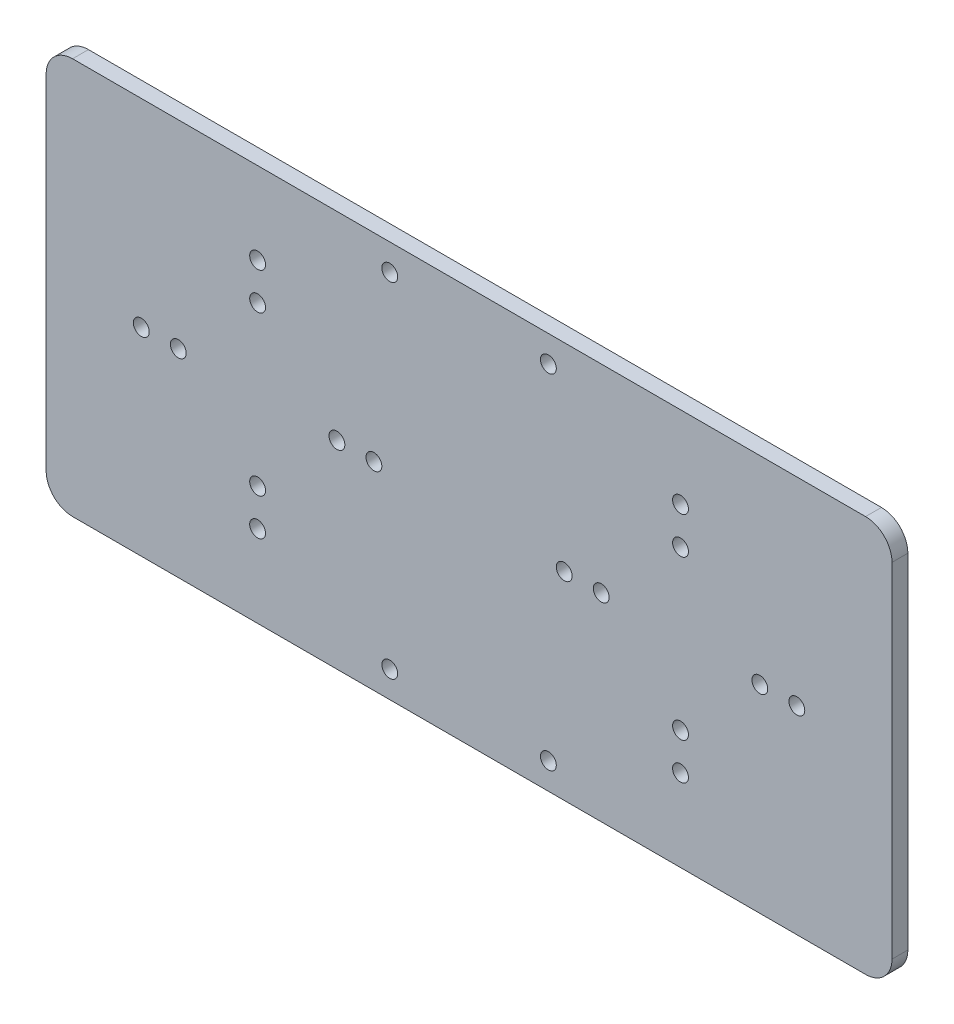
ISO-10303-21;
HEADER;
FILE_DESCRIPTION(('STEP AP214'),'2;1');
FILE_NAME('part.step','',(''),(''),'','','');
FILE_SCHEMA(('AUTOMOTIVE_DESIGN { 1 0 10303 214 1 1 1 1 }'));
ENDSEC;
DATA;
#1=APPLICATION_CONTEXT('core data for automotive mechanical design processes');
#2=APPLICATION_PROTOCOL_DEFINITION('international standard','automotive_design',2000,#1);
#3=PRODUCT_CONTEXT('',#1,'mechanical');
#4=PRODUCT('Part','Part','',(#3));
#5=PRODUCT_RELATED_PRODUCT_CATEGORY('part','',(#4));
#6=PRODUCT_DEFINITION_FORMATION('','',#4);
#7=PRODUCT_DEFINITION_CONTEXT('part definition',#1,'design');
#8=PRODUCT_DEFINITION('design','',#6,#7);
#9=PRODUCT_DEFINITION_SHAPE('','',#8);
#10=(LENGTH_UNIT() NAMED_UNIT(*) SI_UNIT(.MILLI.,.METRE.));
#11=(NAMED_UNIT(*) PLANE_ANGLE_UNIT() SI_UNIT($,.RADIAN.));
#12=(NAMED_UNIT(*) SI_UNIT($,.STERADIAN.) SOLID_ANGLE_UNIT());
#13=UNCERTAINTY_MEASURE_WITH_UNIT(LENGTH_MEASURE(1.E-05),#10,'distance_accuracy_value','');
#14=(GEOMETRIC_REPRESENTATION_CONTEXT(3) GLOBAL_UNCERTAINTY_ASSIGNED_CONTEXT((#13)) GLOBAL_UNIT_ASSIGNED_CONTEXT((#10,
#11,#12)) REPRESENTATION_CONTEXT('',''));
#15=CARTESIAN_POINT('',(0.,0.,0.));
#16=DIRECTION('',(0.,0.,1.));
#17=DIRECTION('',(1.,0.,0.));
#18=AXIS2_PLACEMENT_3D('',#15,#16,#17);
#19=CARTESIAN_POINT('',(0.,0.,3.));
#20=DIRECTION('',(1.,0.,0.));
#21=DIRECTION('',(0.,1.,0.));
#22=AXIS2_PLACEMENT_3D('',#19,#20,#21);
#23=PLANE('',#22);
#24=DIRECTION('',(0.,-1.,0.));
#25=VECTOR('',#24,1.);
#26=CARTESIAN_POINT('',(0.,0.,0.));
#27=LINE('',#26,#25);
#28=CARTESIAN_POINT('',(0.,-5.,0.));
#29=VERTEX_POINT('',#28);
#30=CARTESIAN_POINT('',(0.,-70.,0.));
#31=VERTEX_POINT('',#30);
#32=EDGE_CURVE('E189',#29,#31,#27,.T.);
#33=ORIENTED_EDGE('',*,*,#32,.T.);
#34=DIRECTION('',(0.,0.,-1.));
#35=VECTOR('',#34,1.);
#36=CARTESIAN_POINT('',(0.,-70.,3.));
#37=LINE('',#36,#35);
#38=CARTESIAN_POINT('',(0.,-70.,3.));
#39=VERTEX_POINT('',#38);
#40=EDGE_CURVE('E166',#31,#39,#37,.F.);
#41=ORIENTED_EDGE('',*,*,#40,.T.);
#42=DIRECTION('',(0.,-1.,0.));
#43=VECTOR('',#42,1.);
#44=CARTESIAN_POINT('',(0.,0.,3.));
#45=LINE('',#44,#43);
#46=CARTESIAN_POINT('',(0.,-5.,3.));
#47=VERTEX_POINT('',#46);
#48=EDGE_CURVE('E130',#47,#39,#45,.T.);
#49=ORIENTED_EDGE('',*,*,#48,.F.);
#50=DIRECTION('',(0.,0.,-1.));
#51=VECTOR('',#50,1.);
#52=CARTESIAN_POINT('',(0.,-5.,3.));
#53=LINE('',#52,#51);
#54=EDGE_CURVE('E147',#47,#29,#53,.T.);
#55=ORIENTED_EDGE('',*,*,#54,.T.);
#56=EDGE_LOOP('',(#33,#41,#49,#55));
#57=FACE_BOUND('',#56,.T.);
#58=ADVANCED_FACE('F39',(#57),#23,.F.);
#59=CARTESIAN_POINT('',(0.,-75.,3.));
#60=DIRECTION('',(0.,1.,0.));
#61=DIRECTION('',(0.,0.,1.));
#62=AXIS2_PLACEMENT_3D('',#59,#60,#61);
#63=PLANE('',#62);
#64=DIRECTION('',(1.,0.,0.));
#65=VECTOR('',#64,1.);
#66=CARTESIAN_POINT('',(0.,-75.,0.));
#67=LINE('',#66,#65);
#68=CARTESIAN_POINT('',(5.00000000000001,-75.,0.));
#69=VERTEX_POINT('',#68);
#70=CARTESIAN_POINT('',(155.,-75.,0.));
#71=VERTEX_POINT('',#70);
#72=EDGE_CURVE('E138',#69,#71,#67,.T.);
#73=ORIENTED_EDGE('',*,*,#72,.T.);
#74=DIRECTION('',(0.,0.,-1.));
#75=VECTOR('',#74,1.);
#76=CARTESIAN_POINT('',(155.,-75.,3.));
#77=LINE('',#76,#75);
#78=CARTESIAN_POINT('',(155.,-75.,3.));
#79=VERTEX_POINT('',#78);
#80=EDGE_CURVE('E48',#71,#79,#77,.F.);
#81=ORIENTED_EDGE('',*,*,#80,.T.);
#82=DIRECTION('',(1.,0.,0.));
#83=VECTOR('',#82,1.);
#84=CARTESIAN_POINT('',(0.,-75.,3.));
#85=LINE('',#84,#83);
#86=CARTESIAN_POINT('',(5.00000000000001,-75.,3.));
#87=VERTEX_POINT('',#86);
#88=EDGE_CURVE('E136',#87,#79,#85,.T.);
#89=ORIENTED_EDGE('',*,*,#88,.F.);
#90=DIRECTION('',(0.,0.,-1.));
#91=VECTOR('',#90,1.);
#92=CARTESIAN_POINT('',(5.00000000000001,-75.,3.));
#93=LINE('',#92,#91);
#94=EDGE_CURVE('E159',#87,#69,#93,.T.);
#95=ORIENTED_EDGE('',*,*,#94,.T.);
#96=EDGE_LOOP('',(#73,#81,#89,#95));
#97=FACE_BOUND('',#96,.T.);
#98=ADVANCED_FACE('F194',(#97),#63,.F.);
#99=CARTESIAN_POINT('',(160.,0.,3.));
#100=DIRECTION('',(-1.,0.,0.));
#101=DIRECTION('',(0.,0.,1.));
#102=AXIS2_PLACEMENT_3D('',#99,#100,#101);
#103=PLANE('',#102);
#104=DIRECTION('',(0.,1.,0.));
#105=VECTOR('',#104,1.);
#106=CARTESIAN_POINT('',(160.,0.,3.));
#107=LINE('',#106,#105);
#108=CARTESIAN_POINT('',(160.,-70.,3.));
#109=VERTEX_POINT('',#108);
#110=CARTESIAN_POINT('',(160.,-5.,3.));
#111=VERTEX_POINT('',#110);
#112=EDGE_CURVE('E180',#109,#111,#107,.T.);
#113=ORIENTED_EDGE('',*,*,#112,.F.);
#114=DIRECTION('',(0.,0.,-1.));
#115=VECTOR('',#114,1.);
#116=CARTESIAN_POINT('',(160.,-70.,3.));
#117=LINE('',#116,#115);
#118=CARTESIAN_POINT('',(160.,-70.,0.));
#119=VERTEX_POINT('',#118);
#120=EDGE_CURVE('E172',#109,#119,#117,.T.);
#121=ORIENTED_EDGE('',*,*,#120,.T.);
#122=DIRECTION('',(0.,1.,0.));
#123=VECTOR('',#122,1.);
#124=CARTESIAN_POINT('',(160.,0.,0.));
#125=LINE('',#124,#123);
#126=CARTESIAN_POINT('',(160.,-5.,0.));
#127=VERTEX_POINT('',#126);
#128=EDGE_CURVE('E131',#119,#127,#125,.T.);
#129=ORIENTED_EDGE('',*,*,#128,.T.);
#130=DIRECTION('',(0.,0.,-1.));
#131=VECTOR('',#130,1.);
#132=CARTESIAN_POINT('',(160.,-5.,3.));
#133=LINE('',#132,#131);
#134=EDGE_CURVE('E112',#127,#111,#133,.F.);
#135=ORIENTED_EDGE('',*,*,#134,.T.);
#136=EDGE_LOOP('',(#113,#121,#129,#135));
#137=FACE_BOUND('',#136,.T.);
#138=ADVANCED_FACE('F201',(#137),#103,.F.);
#139=CARTESIAN_POINT('',(0.,0.,3.));
#140=DIRECTION('',(0.,-1.,0.));
#141=DIRECTION('',(0.,0.,-1.));
#142=AXIS2_PLACEMENT_3D('',#139,#140,#141);
#143=PLANE('',#142);
#144=DIRECTION('',(-1.,0.,0.));
#145=VECTOR('',#144,1.);
#146=CARTESIAN_POINT('',(0.,0.,0.));
#147=LINE('',#146,#145);
#148=CARTESIAN_POINT('',(155.,0.,0.));
#149=VERTEX_POINT('',#148);
#150=CARTESIAN_POINT('',(5.,0.,0.));
#151=VERTEX_POINT('',#150);
#152=EDGE_CURVE('E120',#149,#151,#147,.T.);
#153=ORIENTED_EDGE('',*,*,#152,.T.);
#154=DIRECTION('',(0.,0.,-1.));
#155=VECTOR('',#154,1.);
#156=CARTESIAN_POINT('',(5.,0.,3.));
#157=LINE('',#156,#155);
#158=CARTESIAN_POINT('',(5.,0.,3.));
#159=VERTEX_POINT('',#158);
#160=EDGE_CURVE('E153',#151,#159,#157,.F.);
#161=ORIENTED_EDGE('',*,*,#160,.T.);
#162=DIRECTION('',(-1.,0.,0.));
#163=VECTOR('',#162,1.);
#164=CARTESIAN_POINT('',(0.,0.,3.));
#165=LINE('',#164,#163);
#166=CARTESIAN_POINT('',(155.,0.,3.));
#167=VERTEX_POINT('',#166);
#168=EDGE_CURVE('E123',#167,#159,#165,.T.);
#169=ORIENTED_EDGE('',*,*,#168,.F.);
#170=DIRECTION('',(0.,0.,-1.));
#171=VECTOR('',#170,1.);
#172=CARTESIAN_POINT('',(155.,0.,3.));
#173=LINE('',#172,#171);
#174=EDGE_CURVE('E110',#167,#149,#173,.T.);
#175=ORIENTED_EDGE('',*,*,#174,.T.);
#176=EDGE_LOOP('',(#153,#161,#169,#175));
#177=FACE_BOUND('',#176,.T.);
#178=ADVANCED_FACE('F119',(#177),#143,.F.);
#179=CARTESIAN_POINT('',(0.,0.,3.));
#180=DIRECTION('',(0.,0.,1.));
#181=DIRECTION('',(1.,0.,0.));
#182=AXIS2_PLACEMENT_3D('',#179,#180,#181);
#183=PLANE('',#182);
#184=CARTESIAN_POINT('',(95.,-5.,3.));
#185=DIRECTION('',(0.,0.,1.));
#186=DIRECTION('',(1.,0.,0.));
#187=AXIS2_PLACEMENT_3D('',#184,#185,#186);
#188=CIRCLE('',#187,1.5);
#189=CARTESIAN_POINT('',(96.5,-5.,3.));
#190=VERTEX_POINT('',#189);
#191=EDGE_CURVE('E513',#190,#190,#188,.T.);
#192=ORIENTED_EDGE('',*,*,#191,.F.);
#193=EDGE_LOOP('',(#192));
#194=FACE_BOUND('',#193,.T.);
#195=CARTESIAN_POINT('',(65.,-70.,3.));
#196=DIRECTION('',(0.,0.,1.));
#197=DIRECTION('',(1.,0.,0.));
#198=AXIS2_PLACEMENT_3D('',#195,#196,#197);
#199=CIRCLE('',#198,1.5);
#200=CARTESIAN_POINT('',(66.5,-70.,3.));
#201=VERTEX_POINT('',#200);
#202=EDGE_CURVE('E505',#201,#201,#199,.T.);
#203=ORIENTED_EDGE('',*,*,#202,.F.);
#204=EDGE_LOOP('',(#203));
#205=FACE_BOUND('',#204,.T.);
#206=CARTESIAN_POINT('',(95.,-70.,3.));
#207=DIRECTION('',(0.,0.,1.));
#208=DIRECTION('',(1.,0.,0.));
#209=AXIS2_PLACEMENT_3D('',#206,#207,#208);
#210=CIRCLE('',#209,1.5);
#211=CARTESIAN_POINT('',(96.5,-70.,3.));
#212=VERTEX_POINT('',#211);
#213=EDGE_CURVE('E500',#212,#212,#210,.T.);
#214=ORIENTED_EDGE('',*,*,#213,.F.);
#215=EDGE_LOOP('',(#214));
#216=FACE_BOUND('',#215,.T.);
#217=CARTESIAN_POINT('',(65.,-5.,3.));
#218=DIRECTION('',(0.,0.,1.));
#219=DIRECTION('',(1.,0.,0.));
#220=AXIS2_PLACEMENT_3D('',#217,#218,#219);
#221=CIRCLE('',#220,1.5);
#222=CARTESIAN_POINT('',(66.5,-5.,3.));
#223=VERTEX_POINT('',#222);
#224=EDGE_CURVE('E512',#223,#223,#221,.T.);
#225=ORIENTED_EDGE('',*,*,#224,.F.);
#226=EDGE_LOOP('',(#225));
#227=FACE_BOUND('',#226,.T.);
#228=CARTESIAN_POINT('',(120.,-15.5,3.));
#229=DIRECTION('',(0.,0.,1.));
#230=DIRECTION('',(1.,0.,0.));
#231=AXIS2_PLACEMENT_3D('',#228,#229,#230);
#232=CIRCLE('',#231,1.5);
#233=CARTESIAN_POINT('',(121.5,-15.5,3.));
#234=VERTEX_POINT('',#233);
#235=EDGE_CURVE('E537',#234,#234,#232,.T.);
#236=ORIENTED_EDGE('',*,*,#235,.F.);
#237=EDGE_LOOP('',(#236));
#238=FACE_BOUND('',#237,.T.);
#239=CARTESIAN_POINT('',(135.,-37.5,3.));
#240=DIRECTION('',(0.,0.,1.));
#241=DIRECTION('',(1.,0.,0.));
#242=AXIS2_PLACEMENT_3D('',#239,#240,#241);
#243=CIRCLE('',#242,1.5);
#244=CARTESIAN_POINT('',(136.5,-37.5,3.));
#245=VERTEX_POINT('',#244);
#246=EDGE_CURVE('E528',#245,#245,#243,.T.);
#247=ORIENTED_EDGE('',*,*,#246,.F.);
#248=EDGE_LOOP('',(#247));
#249=FACE_BOUND('',#248,.T.);
#250=CARTESIAN_POINT('',(120.,-52.5,3.));
#251=DIRECTION('',(0.,0.,1.));
#252=DIRECTION('',(1.,0.,0.));
#253=AXIS2_PLACEMENT_3D('',#250,#251,#252);
#254=CIRCLE('',#253,1.5);
#255=CARTESIAN_POINT('',(121.5,-52.5,3.));
#256=VERTEX_POINT('',#255);
#257=EDGE_CURVE('E555',#256,#256,#254,.T.);
#258=ORIENTED_EDGE('',*,*,#257,.F.);
#259=EDGE_LOOP('',(#258));
#260=FACE_BOUND('',#259,.T.);
#261=CARTESIAN_POINT('',(105.,-37.5,3.));
#262=DIRECTION('',(0.,0.,1.));
#263=DIRECTION('',(1.,0.,0.));
#264=AXIS2_PLACEMENT_3D('',#261,#262,#263);
#265=CIRCLE('',#264,1.5);
#266=CARTESIAN_POINT('',(106.5,-37.5,3.));
#267=VERTEX_POINT('',#266);
#268=EDGE_CURVE('E547',#267,#267,#265,.T.);
#269=ORIENTED_EDGE('',*,*,#268,.F.);
#270=EDGE_LOOP('',(#269));
#271=FACE_BOUND('',#270,.T.);
#272=CARTESIAN_POINT('',(98.,-37.5,3.));
#273=DIRECTION('',(0.,0.,1.));
#274=DIRECTION('',(1.,0.,0.));
#275=AXIS2_PLACEMENT_3D('',#272,#273,#274);
#276=CIRCLE('',#275,1.5);
#277=CARTESIAN_POINT('',(99.5,-37.5,3.));
#278=VERTEX_POINT('',#277);
#279=EDGE_CURVE('E585',#278,#278,#276,.T.);
#280=ORIENTED_EDGE('',*,*,#279,.F.);
#281=EDGE_LOOP('',(#280));
#282=FACE_BOUND('',#281,.T.);
#283=CARTESIAN_POINT('',(120.,-59.5,3.));
#284=DIRECTION('',(0.,0.,1.));
#285=DIRECTION('',(1.,0.,0.));
#286=AXIS2_PLACEMENT_3D('',#283,#284,#285);
#287=CIRCLE('',#286,1.5);
#288=CARTESIAN_POINT('',(121.5,-59.5,3.));
#289=VERTEX_POINT('',#288);
#290=EDGE_CURVE('E570',#289,#289,#287,.T.);
#291=ORIENTED_EDGE('',*,*,#290,.F.);
#292=EDGE_LOOP('',(#291));
#293=FACE_BOUND('',#292,.T.);
#294=CARTESIAN_POINT('',(142.,-37.5,3.));
#295=DIRECTION('',(0.,0.,1.));
#296=DIRECTION('',(1.,0.,0.));
#297=AXIS2_PLACEMENT_3D('',#294,#295,#296);
#298=CIRCLE('',#297,1.5);
#299=CARTESIAN_POINT('',(143.5,-37.5,3.));
#300=VERTEX_POINT('',#299);
#301=EDGE_CURVE('E571',#300,#300,#298,.T.);
#302=ORIENTED_EDGE('',*,*,#301,.F.);
#303=EDGE_LOOP('',(#302));
#304=FACE_BOUND('',#303,.T.);
#305=CARTESIAN_POINT('',(120.,-22.5,3.));
#306=DIRECTION('',(0.,0.,1.));
#307=DIRECTION('',(1.,0.,0.));
#308=AXIS2_PLACEMENT_3D('',#305,#306,#307);
#309=CIRCLE('',#308,1.5);
#310=CARTESIAN_POINT('',(121.5,-22.5,3.));
#311=VERTEX_POINT('',#310);
#312=EDGE_CURVE('E546',#311,#311,#309,.T.);
#313=ORIENTED_EDGE('',*,*,#312,.F.);
#314=EDGE_LOOP('',(#313));
#315=FACE_BOUND('',#314,.T.);
#316=CARTESIAN_POINT('',(40.,-15.5,3.));
#317=DIRECTION('',(0.,0.,1.));
#318=DIRECTION('',(1.,0.,0.));
#319=AXIS2_PLACEMENT_3D('',#316,#317,#318);
#320=CIRCLE('',#319,1.5);
#321=CARTESIAN_POINT('',(41.5,-15.5,3.));
#322=VERTEX_POINT('',#321);
#323=EDGE_CURVE('E599',#322,#322,#320,.T.);
#324=ORIENTED_EDGE('',*,*,#323,.F.);
#325=EDGE_LOOP('',(#324));
#326=FACE_BOUND('',#325,.T.);
#327=CARTESIAN_POINT('',(40.,-52.5,3.));
#328=DIRECTION('',(0.,0.,1.));
#329=DIRECTION('',(1.,0.,0.));
#330=AXIS2_PLACEMENT_3D('',#327,#328,#329);
#331=CIRCLE('',#330,1.5);
#332=CARTESIAN_POINT('',(41.5,-52.5,3.));
#333=VERTEX_POINT('',#332);
#334=EDGE_CURVE('E536',#333,#333,#331,.T.);
#335=ORIENTED_EDGE('',*,*,#334,.F.);
#336=EDGE_LOOP('',(#335));
#337=FACE_BOUND('',#336,.T.);
#338=CARTESIAN_POINT('',(55.,-37.5,3.));
#339=DIRECTION('',(0.,0.,1.));
#340=DIRECTION('',(1.,0.,0.));
#341=AXIS2_PLACEMENT_3D('',#338,#339,#340);
#342=CIRCLE('',#341,1.5);
#343=CARTESIAN_POINT('',(56.5,-37.5,3.));
#344=VERTEX_POINT('',#343);
#345=EDGE_CURVE('E617',#344,#344,#342,.T.);
#346=ORIENTED_EDGE('',*,*,#345,.F.);
#347=EDGE_LOOP('',(#346));
#348=FACE_BOUND('',#347,.T.);
#349=CARTESIAN_POINT('',(25.,-37.5,3.));
#350=DIRECTION('',(0.,0.,1.));
#351=DIRECTION('',(1.,0.,0.));
#352=AXIS2_PLACEMENT_3D('',#349,#350,#351);
#353=CIRCLE('',#352,1.5);
#354=CARTESIAN_POINT('',(26.5,-37.5,3.));
#355=VERTEX_POINT('',#354);
#356=EDGE_CURVE('E609',#355,#355,#353,.T.);
#357=ORIENTED_EDGE('',*,*,#356,.F.);
#358=EDGE_LOOP('',(#357));
#359=FACE_BOUND('',#358,.T.);
#360=CARTESIAN_POINT('',(18.,-37.5,3.));
#361=DIRECTION('',(0.,0.,1.));
#362=DIRECTION('',(1.,0.,0.));
#363=AXIS2_PLACEMENT_3D('',#360,#361,#362);
#364=CIRCLE('',#363,1.5);
#365=CARTESIAN_POINT('',(19.5,-37.5,3.));
#366=VERTEX_POINT('',#365);
#367=EDGE_CURVE('E647',#366,#366,#364,.T.);
#368=ORIENTED_EDGE('',*,*,#367,.F.);
#369=EDGE_LOOP('',(#368));
#370=FACE_BOUND('',#369,.T.);
#371=CARTESIAN_POINT('',(62.,-37.5,3.));
#372=DIRECTION('',(0.,0.,1.));
#373=DIRECTION('',(1.,0.,0.));
#374=AXIS2_PLACEMENT_3D('',#371,#372,#373);
#375=CIRCLE('',#374,1.5);
#376=CARTESIAN_POINT('',(63.5,-37.5,3.));
#377=VERTEX_POINT('',#376);
#378=EDGE_CURVE('E632',#377,#377,#375,.T.);
#379=ORIENTED_EDGE('',*,*,#378,.F.);
#380=EDGE_LOOP('',(#379));
#381=FACE_BOUND('',#380,.T.);
#382=CARTESIAN_POINT('',(40.,-59.5,3.));
#383=DIRECTION('',(0.,0.,1.));
#384=DIRECTION('',(1.,0.,0.));
#385=AXIS2_PLACEMENT_3D('',#382,#383,#384);
#386=CIRCLE('',#385,1.5);
#387=CARTESIAN_POINT('',(41.5,-59.5,3.));
#388=VERTEX_POINT('',#387);
#389=EDGE_CURVE('E633',#388,#388,#386,.T.);
#390=ORIENTED_EDGE('',*,*,#389,.F.);
#391=EDGE_LOOP('',(#390));
#392=FACE_BOUND('',#391,.T.);
#393=CARTESIAN_POINT('',(40.,-22.5,3.));
#394=DIRECTION('',(0.,0.,1.));
#395=DIRECTION('',(1.,0.,0.));
#396=AXIS2_PLACEMENT_3D('',#393,#394,#395);
#397=CIRCLE('',#396,1.5);
#398=CARTESIAN_POINT('',(41.5,-22.5,3.));
#399=VERTEX_POINT('',#398);
#400=EDGE_CURVE('E608',#399,#399,#397,.T.);
#401=ORIENTED_EDGE('',*,*,#400,.F.);
#402=EDGE_LOOP('',(#401));
#403=FACE_BOUND('',#402,.T.);
#404=ORIENTED_EDGE('',*,*,#88,.T.);
#405=CARTESIAN_POINT('',(155.,-70.,3.));
#406=DIRECTION('',(0.,0.,1.));
#407=DIRECTION('',(1.,0.,0.));
#408=AXIS2_PLACEMENT_3D('',#405,#406,#407);
#409=CIRCLE('',#408,5.);
#410=EDGE_CURVE('E11',#79,#109,#409,.T.);
#411=ORIENTED_EDGE('',*,*,#410,.T.);
#412=ORIENTED_EDGE('',*,*,#112,.T.);
#413=CARTESIAN_POINT('',(155.,-5.,3.));
#414=DIRECTION('',(0.,0.,1.));
#415=DIRECTION('',(1.,0.,0.));
#416=AXIS2_PLACEMENT_3D('',#413,#414,#415);
#417=CIRCLE('',#416,5.);
#418=EDGE_CURVE('E144',#111,#167,#417,.T.);
#419=ORIENTED_EDGE('',*,*,#418,.T.);
#420=ORIENTED_EDGE('',*,*,#168,.T.);
#421=CARTESIAN_POINT('',(5.,-5.,3.));
#422=DIRECTION('',(0.,0.,1.));
#423=DIRECTION('',(1.,0.,0.));
#424=AXIS2_PLACEMENT_3D('',#421,#422,#423);
#425=CIRCLE('',#424,5.);
#426=EDGE_CURVE('E156',#159,#47,#425,.T.);
#427=ORIENTED_EDGE('',*,*,#426,.T.);
#428=ORIENTED_EDGE('',*,*,#48,.T.);
#429=CARTESIAN_POINT('',(5.00000000000001,-70.,3.));
#430=DIRECTION('',(0.,0.,1.));
#431=DIRECTION('',(1.,0.,0.));
#432=AXIS2_PLACEMENT_3D('',#429,#430,#431);
#433=CIRCLE('',#432,5.);
#434=EDGE_CURVE('E169',#39,#87,#433,.T.);
#435=ORIENTED_EDGE('',*,*,#434,.T.);
#436=EDGE_LOOP('',(#404,#411,#412,#419,#420,#427,#428,#435));
#437=FACE_BOUND('',#436,.T.);
#438=ADVANCED_FACE('F199',(#194,#205,#216,#227,#238,#249,#260,#271,#282,#293,#304,#315,#326,
#337,#348,#359,#370,#381,#392,#403,#437),#183,.T.);
#439=CARTESIAN_POINT('',(0.,0.,0.));
#440=DIRECTION('',(0.,0.,1.));
#441=DIRECTION('',(1.,0.,0.));
#442=AXIS2_PLACEMENT_3D('',#439,#440,#441);
#443=PLANE('',#442);
#444=CARTESIAN_POINT('',(95.,-5.,0.));
#445=DIRECTION('',(0.,0.,1.));
#446=DIRECTION('',(1.,0.,0.));
#447=AXIS2_PLACEMENT_3D('',#444,#445,#446);
#448=CIRCLE('',#447,1.5);
#449=CARTESIAN_POINT('',(96.5,-5.,0.));
#450=VERTEX_POINT('',#449);
#451=EDGE_CURVE('E508',#450,#450,#448,.T.);
#452=ORIENTED_EDGE('',*,*,#451,.T.);
#453=EDGE_LOOP('',(#452));
#454=FACE_BOUND('',#453,.T.);
#455=CARTESIAN_POINT('',(65.,-70.,0.));
#456=DIRECTION('',(0.,0.,1.));
#457=DIRECTION('',(1.,0.,0.));
#458=AXIS2_PLACEMENT_3D('',#455,#456,#457);
#459=CIRCLE('',#458,1.5);
#460=CARTESIAN_POINT('',(66.5,-70.,0.));
#461=VERTEX_POINT('',#460);
#462=EDGE_CURVE('E517',#461,#461,#459,.T.);
#463=ORIENTED_EDGE('',*,*,#462,.T.);
#464=EDGE_LOOP('',(#463));
#465=FACE_BOUND('',#464,.T.);
#466=CARTESIAN_POINT('',(95.,-70.,0.));
#467=DIRECTION('',(0.,0.,1.));
#468=DIRECTION('',(1.,0.,0.));
#469=AXIS2_PLACEMENT_3D('',#466,#467,#468);
#470=CIRCLE('',#469,1.5);
#471=CARTESIAN_POINT('',(96.5,-70.,0.));
#472=VERTEX_POINT('',#471);
#473=EDGE_CURVE('E497',#472,#472,#470,.T.);
#474=ORIENTED_EDGE('',*,*,#473,.T.);
#475=EDGE_LOOP('',(#474));
#476=FACE_BOUND('',#475,.T.);
#477=CARTESIAN_POINT('',(65.,-5.,0.));
#478=DIRECTION('',(0.,0.,1.));
#479=DIRECTION('',(1.,0.,0.));
#480=AXIS2_PLACEMENT_3D('',#477,#478,#479);
#481=CIRCLE('',#480,1.5);
#482=CARTESIAN_POINT('',(66.5,-5.,0.));
#483=VERTEX_POINT('',#482);
#484=EDGE_CURVE('E524',#483,#483,#481,.T.);
#485=ORIENTED_EDGE('',*,*,#484,.T.);
#486=EDGE_LOOP('',(#485));
#487=FACE_BOUND('',#486,.T.);
#488=CARTESIAN_POINT('',(120.,-15.5,0.));
#489=DIRECTION('',(0.,0.,1.));
#490=DIRECTION('',(1.,0.,0.));
#491=AXIS2_PLACEMENT_3D('',#488,#489,#490);
#492=CIRCLE('',#491,1.5);
#493=CARTESIAN_POINT('',(121.5,-15.5,0.));
#494=VERTEX_POINT('',#493);
#495=EDGE_CURVE('E532',#494,#494,#492,.T.);
#496=ORIENTED_EDGE('',*,*,#495,.T.);
#497=EDGE_LOOP('',(#496));
#498=FACE_BOUND('',#497,.T.);
#499=CARTESIAN_POINT('',(135.,-37.5,0.));
#500=DIRECTION('',(0.,0.,1.));
#501=DIRECTION('',(1.,0.,0.));
#502=AXIS2_PLACEMENT_3D('',#499,#500,#501);
#503=CIRCLE('',#502,1.5);
#504=CARTESIAN_POINT('',(136.5,-37.5,0.));
#505=VERTEX_POINT('',#504);
#506=EDGE_CURVE('E559',#505,#505,#503,.T.);
#507=ORIENTED_EDGE('',*,*,#506,.T.);
#508=EDGE_LOOP('',(#507));
#509=FACE_BOUND('',#508,.T.);
#510=CARTESIAN_POINT('',(120.,-52.5,0.));
#511=DIRECTION('',(0.,0.,1.));
#512=DIRECTION('',(1.,0.,0.));
#513=AXIS2_PLACEMENT_3D('',#510,#511,#512);
#514=CIRCLE('',#513,1.5);
#515=CARTESIAN_POINT('',(121.5,-52.5,0.));
#516=VERTEX_POINT('',#515);
#517=EDGE_CURVE('E551',#516,#516,#514,.T.);
#518=ORIENTED_EDGE('',*,*,#517,.T.);
#519=EDGE_LOOP('',(#518));
#520=FACE_BOUND('',#519,.T.);
#521=CARTESIAN_POINT('',(105.,-37.5,0.));
#522=DIRECTION('',(0.,0.,1.));
#523=DIRECTION('',(1.,0.,0.));
#524=AXIS2_PLACEMENT_3D('',#521,#522,#523);
#525=CIRCLE('',#524,1.5);
#526=CARTESIAN_POINT('',(106.5,-37.5,0.));
#527=VERTEX_POINT('',#526);
#528=EDGE_CURVE('E542',#527,#527,#525,.T.);
#529=ORIENTED_EDGE('',*,*,#528,.T.);
#530=EDGE_LOOP('',(#529));
#531=FACE_BOUND('',#530,.T.);
#532=CARTESIAN_POINT('',(98.,-37.5,0.));
#533=DIRECTION('',(0.,0.,1.));
#534=DIRECTION('',(1.,0.,0.));
#535=AXIS2_PLACEMENT_3D('',#532,#533,#534);
#536=CIRCLE('',#535,1.5);
#537=CARTESIAN_POINT('',(99.5,-37.5,0.));
#538=VERTEX_POINT('',#537);
#539=EDGE_CURVE('E541',#538,#538,#536,.T.);
#540=ORIENTED_EDGE('',*,*,#539,.T.);
#541=EDGE_LOOP('',(#540));
#542=FACE_BOUND('',#541,.T.);
#543=CARTESIAN_POINT('',(120.,-59.5,0.));
#544=DIRECTION('',(0.,0.,1.));
#545=DIRECTION('',(1.,0.,0.));
#546=AXIS2_PLACEMENT_3D('',#543,#544,#545);
#547=CIRCLE('',#546,1.5);
#548=CARTESIAN_POINT('',(121.5,-59.5,0.));
#549=VERTEX_POINT('',#548);
#550=EDGE_CURVE('E589',#549,#549,#547,.T.);
#551=ORIENTED_EDGE('',*,*,#550,.T.);
#552=EDGE_LOOP('',(#551));
#553=FACE_BOUND('',#552,.T.);
#554=CARTESIAN_POINT('',(142.,-37.5,0.));
#555=DIRECTION('',(0.,0.,1.));
#556=DIRECTION('',(1.,0.,0.));
#557=AXIS2_PLACEMENT_3D('',#554,#555,#556);
#558=CIRCLE('',#557,1.5);
#559=CARTESIAN_POINT('',(143.5,-37.5,0.));
#560=VERTEX_POINT('',#559);
#561=EDGE_CURVE('E566',#560,#560,#558,.T.);
#562=ORIENTED_EDGE('',*,*,#561,.T.);
#563=EDGE_LOOP('',(#562));
#564=FACE_BOUND('',#563,.T.);
#565=CARTESIAN_POINT('',(120.,-22.5,0.));
#566=DIRECTION('',(0.,0.,1.));
#567=DIRECTION('',(1.,0.,0.));
#568=AXIS2_PLACEMENT_3D('',#565,#566,#567);
#569=CIRCLE('',#568,1.5);
#570=CARTESIAN_POINT('',(121.5,-22.5,0.));
#571=VERTEX_POINT('',#570);
#572=EDGE_CURVE('E575',#571,#571,#569,.T.);
#573=ORIENTED_EDGE('',*,*,#572,.T.);
#574=EDGE_LOOP('',(#573));
#575=FACE_BOUND('',#574,.T.);
#576=CARTESIAN_POINT('',(40.,-15.5,0.));
#577=DIRECTION('',(0.,0.,1.));
#578=DIRECTION('',(1.,0.,0.));
#579=AXIS2_PLACEMENT_3D('',#576,#577,#578);
#580=CIRCLE('',#579,1.5);
#581=CARTESIAN_POINT('',(41.5,-15.5,0.));
#582=VERTEX_POINT('',#581);
#583=EDGE_CURVE('E192',#582,#582,#580,.T.);
#584=ORIENTED_EDGE('',*,*,#583,.T.);
#585=EDGE_LOOP('',(#584));
#586=FACE_BOUND('',#585,.T.);
#587=CARTESIAN_POINT('',(40.,-52.5,0.));
#588=DIRECTION('',(0.,0.,1.));
#589=DIRECTION('',(1.,0.,0.));
#590=AXIS2_PLACEMENT_3D('',#587,#588,#589);
#591=CIRCLE('',#590,1.5);
#592=CARTESIAN_POINT('',(41.5,-52.5,0.));
#593=VERTEX_POINT('',#592);
#594=EDGE_CURVE('E621',#593,#593,#591,.T.);
#595=ORIENTED_EDGE('',*,*,#594,.T.);
#596=EDGE_LOOP('',(#595));
#597=FACE_BOUND('',#596,.T.);
#598=CARTESIAN_POINT('',(55.,-37.5,0.));
#599=DIRECTION('',(0.,0.,1.));
#600=DIRECTION('',(1.,0.,0.));
#601=AXIS2_PLACEMENT_3D('',#598,#599,#600);
#602=CIRCLE('',#601,1.5);
#603=CARTESIAN_POINT('',(56.5,-37.5,0.));
#604=VERTEX_POINT('',#603);
#605=EDGE_CURVE('E613',#604,#604,#602,.T.);
#606=ORIENTED_EDGE('',*,*,#605,.T.);
#607=EDGE_LOOP('',(#606));
#608=FACE_BOUND('',#607,.T.);
#609=CARTESIAN_POINT('',(25.,-37.5,0.));
#610=DIRECTION('',(0.,0.,1.));
#611=DIRECTION('',(1.,0.,0.));
#612=AXIS2_PLACEMENT_3D('',#609,#610,#611);
#613=CIRCLE('',#612,1.5);
#614=CARTESIAN_POINT('',(26.5,-37.5,0.));
#615=VERTEX_POINT('',#614);
#616=EDGE_CURVE('E604',#615,#615,#613,.T.);
#617=ORIENTED_EDGE('',*,*,#616,.T.);
#618=EDGE_LOOP('',(#617));
#619=FACE_BOUND('',#618,.T.);
#620=CARTESIAN_POINT('',(18.,-37.5,0.));
#621=DIRECTION('',(0.,0.,1.));
#622=DIRECTION('',(1.,0.,0.));
#623=AXIS2_PLACEMENT_3D('',#620,#621,#622);
#624=CIRCLE('',#623,1.5);
#625=CARTESIAN_POINT('',(19.5,-37.5,0.));
#626=VERTEX_POINT('',#625);
#627=EDGE_CURVE('E603',#626,#626,#624,.T.);
#628=ORIENTED_EDGE('',*,*,#627,.T.);
#629=EDGE_LOOP('',(#628));
#630=FACE_BOUND('',#629,.T.);
#631=CARTESIAN_POINT('',(62.,-37.5,0.));
#632=DIRECTION('',(0.,0.,1.));
#633=DIRECTION('',(1.,0.,0.));
#634=AXIS2_PLACEMENT_3D('',#631,#632,#633);
#635=CIRCLE('',#634,1.5);
#636=CARTESIAN_POINT('',(63.5,-37.5,0.));
#637=VERTEX_POINT('',#636);
#638=EDGE_CURVE('E651',#637,#637,#635,.T.);
#639=ORIENTED_EDGE('',*,*,#638,.T.);
#640=EDGE_LOOP('',(#639));
#641=FACE_BOUND('',#640,.T.);
#642=CARTESIAN_POINT('',(40.,-59.5,0.));
#643=DIRECTION('',(0.,0.,1.));
#644=DIRECTION('',(1.,0.,0.));
#645=AXIS2_PLACEMENT_3D('',#642,#643,#644);
#646=CIRCLE('',#645,1.5);
#647=CARTESIAN_POINT('',(41.5,-59.5,0.));
#648=VERTEX_POINT('',#647);
#649=EDGE_CURVE('E628',#648,#648,#646,.T.);
#650=ORIENTED_EDGE('',*,*,#649,.T.);
#651=EDGE_LOOP('',(#650));
#652=FACE_BOUND('',#651,.T.);
#653=CARTESIAN_POINT('',(40.,-22.5,0.));
#654=DIRECTION('',(0.,0.,1.));
#655=DIRECTION('',(1.,0.,0.));
#656=AXIS2_PLACEMENT_3D('',#653,#654,#655);
#657=CIRCLE('',#656,1.5);
#658=CARTESIAN_POINT('',(41.5,-22.5,0.));
#659=VERTEX_POINT('',#658);
#660=EDGE_CURVE('E637',#659,#659,#657,.T.);
#661=ORIENTED_EDGE('',*,*,#660,.T.);
#662=EDGE_LOOP('',(#661));
#663=FACE_BOUND('',#662,.T.);
#664=ORIENTED_EDGE('',*,*,#128,.F.);
#665=CARTESIAN_POINT('',(155.,-70.,0.));
#666=DIRECTION('',(0.,0.,1.));
#667=DIRECTION('',(1.,0.,0.));
#668=AXIS2_PLACEMENT_3D('',#665,#666,#667);
#669=CIRCLE('',#668,5.);
#670=EDGE_CURVE('E62',#119,#71,#669,.F.);
#671=ORIENTED_EDGE('',*,*,#670,.T.);
#672=ORIENTED_EDGE('',*,*,#72,.F.);
#673=CARTESIAN_POINT('',(5.00000000000001,-70.,0.));
#674=DIRECTION('',(0.,0.,1.));
#675=DIRECTION('',(1.,0.,0.));
#676=AXIS2_PLACEMENT_3D('',#673,#674,#675);
#677=CIRCLE('',#676,5.);
#678=EDGE_CURVE('E163',#69,#31,#677,.F.);
#679=ORIENTED_EDGE('',*,*,#678,.T.);
#680=ORIENTED_EDGE('',*,*,#32,.F.);
#681=CARTESIAN_POINT('',(5.,-5.,0.));
#682=DIRECTION('',(0.,0.,1.));
#683=DIRECTION('',(1.,0.,0.));
#684=AXIS2_PLACEMENT_3D('',#681,#682,#683);
#685=CIRCLE('',#684,5.);
#686=EDGE_CURVE('E128',#29,#151,#685,.F.);
#687=ORIENTED_EDGE('',*,*,#686,.T.);
#688=ORIENTED_EDGE('',*,*,#152,.F.);
#689=CARTESIAN_POINT('',(155.,-5.,0.));
#690=DIRECTION('',(0.,0.,1.));
#691=DIRECTION('',(1.,0.,0.));
#692=AXIS2_PLACEMENT_3D('',#689,#690,#691);
#693=CIRCLE('',#692,5.);
#694=EDGE_CURVE('E106',#149,#127,#693,.F.);
#695=ORIENTED_EDGE('',*,*,#694,.T.);
#696=EDGE_LOOP('',(#664,#671,#672,#679,#680,#687,#688,#695));
#697=FACE_BOUND('',#696,.T.);
#698=ADVANCED_FACE('F126',(#454,#465,#476,#487,#498,#509,#520,#531,#542,#553,#564,#575,#586,
#597,#608,#619,#630,#641,#652,#663,#697),#443,.F.);
#699=CARTESIAN_POINT('',(40.,-22.5,0.));
#700=DIRECTION('',(0.,0.,1.));
#701=DIRECTION('',(1.,0.,0.));
#702=AXIS2_PLACEMENT_3D('',#699,#700,#701);
#703=CYLINDRICAL_SURFACE('',#702,1.5);
#704=ORIENTED_EDGE('',*,*,#660,.F.);
#705=EDGE_LOOP('',(#704));
#706=FACE_BOUND('',#705,.T.);
#707=ORIENTED_EDGE('',*,*,#400,.T.);
#708=EDGE_LOOP('',(#707));
#709=FACE_BOUND('',#708,.T.);
#710=ADVANCED_FACE('F301',(#706,#709),#703,.F.);
#711=CARTESIAN_POINT('',(40.,-59.5,0.));
#712=DIRECTION('',(0.,0.,1.));
#713=DIRECTION('',(1.,0.,0.));
#714=AXIS2_PLACEMENT_3D('',#711,#712,#713);
#715=CYLINDRICAL_SURFACE('',#714,1.5);
#716=ORIENTED_EDGE('',*,*,#649,.F.);
#717=EDGE_LOOP('',(#716));
#718=FACE_BOUND('',#717,.T.);
#719=ORIENTED_EDGE('',*,*,#389,.T.);
#720=EDGE_LOOP('',(#719));
#721=FACE_BOUND('',#720,.T.);
#722=ADVANCED_FACE('F297',(#718,#721),#715,.F.);
#723=CARTESIAN_POINT('',(62.,-37.5,0.));
#724=DIRECTION('',(0.,0.,1.));
#725=DIRECTION('',(1.,0.,0.));
#726=AXIS2_PLACEMENT_3D('',#723,#724,#725);
#727=CYLINDRICAL_SURFACE('',#726,1.5);
#728=ORIENTED_EDGE('',*,*,#638,.F.);
#729=EDGE_LOOP('',(#728));
#730=FACE_BOUND('',#729,.T.);
#731=ORIENTED_EDGE('',*,*,#378,.T.);
#732=EDGE_LOOP('',(#731));
#733=FACE_BOUND('',#732,.T.);
#734=ADVANCED_FACE('F300',(#730,#733),#727,.F.);
#735=CARTESIAN_POINT('',(18.,-37.5,0.));
#736=DIRECTION('',(0.,0.,1.));
#737=DIRECTION('',(1.,0.,0.));
#738=AXIS2_PLACEMENT_3D('',#735,#736,#737);
#739=CYLINDRICAL_SURFACE('',#738,1.5);
#740=ORIENTED_EDGE('',*,*,#627,.F.);
#741=EDGE_LOOP('',(#740));
#742=FACE_BOUND('',#741,.T.);
#743=ORIENTED_EDGE('',*,*,#367,.T.);
#744=EDGE_LOOP('',(#743));
#745=FACE_BOUND('',#744,.T.);
#746=ADVANCED_FACE('F289',(#742,#745),#739,.F.);
#747=CARTESIAN_POINT('',(25.,-37.5,0.));
#748=DIRECTION('',(0.,0.,1.));
#749=DIRECTION('',(1.,0.,0.));
#750=AXIS2_PLACEMENT_3D('',#747,#748,#749);
#751=CYLINDRICAL_SURFACE('',#750,1.5);
#752=ORIENTED_EDGE('',*,*,#616,.F.);
#753=EDGE_LOOP('',(#752));
#754=FACE_BOUND('',#753,.T.);
#755=ORIENTED_EDGE('',*,*,#356,.T.);
#756=EDGE_LOOP('',(#755));
#757=FACE_BOUND('',#756,.T.);
#758=ADVANCED_FACE('F285',(#754,#757),#751,.F.);
#759=CARTESIAN_POINT('',(55.,-37.5,0.));
#760=DIRECTION('',(0.,0.,1.));
#761=DIRECTION('',(1.,0.,0.));
#762=AXIS2_PLACEMENT_3D('',#759,#760,#761);
#763=CYLINDRICAL_SURFACE('',#762,1.5);
#764=ORIENTED_EDGE('',*,*,#605,.F.);
#765=EDGE_LOOP('',(#764));
#766=FACE_BOUND('',#765,.T.);
#767=ORIENTED_EDGE('',*,*,#345,.T.);
#768=EDGE_LOOP('',(#767));
#769=FACE_BOUND('',#768,.T.);
#770=ADVANCED_FACE('F288',(#766,#769),#763,.F.);
#771=CARTESIAN_POINT('',(40.,-52.5,0.));
#772=DIRECTION('',(0.,0.,1.));
#773=DIRECTION('',(1.,0.,0.));
#774=AXIS2_PLACEMENT_3D('',#771,#772,#773);
#775=CYLINDRICAL_SURFACE('',#774,1.5);
#776=ORIENTED_EDGE('',*,*,#594,.F.);
#777=EDGE_LOOP('',(#776));
#778=FACE_BOUND('',#777,.T.);
#779=ORIENTED_EDGE('',*,*,#334,.T.);
#780=EDGE_LOOP('',(#779));
#781=FACE_BOUND('',#780,.T.);
#782=ADVANCED_FACE('F283',(#778,#781),#775,.F.);
#783=CARTESIAN_POINT('',(40.,-15.5,0.));
#784=DIRECTION('',(0.,0.,1.));
#785=DIRECTION('',(1.,0.,0.));
#786=AXIS2_PLACEMENT_3D('',#783,#784,#785);
#787=CYLINDRICAL_SURFACE('',#786,1.5);
#788=ORIENTED_EDGE('',*,*,#583,.F.);
#789=EDGE_LOOP('',(#788));
#790=FACE_BOUND('',#789,.T.);
#791=ORIENTED_EDGE('',*,*,#323,.T.);
#792=EDGE_LOOP('',(#791));
#793=FACE_BOUND('',#792,.T.);
#794=ADVANCED_FACE('F273',(#790,#793),#787,.F.);
#795=CARTESIAN_POINT('',(120.,-22.5,0.));
#796=DIRECTION('',(0.,0.,1.));
#797=DIRECTION('',(1.,0.,0.));
#798=AXIS2_PLACEMENT_3D('',#795,#796,#797);
#799=CYLINDRICAL_SURFACE('',#798,1.5);
#800=ORIENTED_EDGE('',*,*,#572,.F.);
#801=EDGE_LOOP('',(#800));
#802=FACE_BOUND('',#801,.T.);
#803=ORIENTED_EDGE('',*,*,#312,.T.);
#804=EDGE_LOOP('',(#803));
#805=FACE_BOUND('',#804,.T.);
#806=ADVANCED_FACE('F269',(#802,#805),#799,.F.);
#807=CARTESIAN_POINT('',(142.,-37.5,0.));
#808=DIRECTION('',(0.,0.,1.));
#809=DIRECTION('',(1.,0.,0.));
#810=AXIS2_PLACEMENT_3D('',#807,#808,#809);
#811=CYLINDRICAL_SURFACE('',#810,1.5);
#812=ORIENTED_EDGE('',*,*,#561,.F.);
#813=EDGE_LOOP('',(#812));
#814=FACE_BOUND('',#813,.T.);
#815=ORIENTED_EDGE('',*,*,#301,.T.);
#816=EDGE_LOOP('',(#815));
#817=FACE_BOUND('',#816,.T.);
#818=ADVANCED_FACE('F265',(#814,#817),#811,.F.);
#819=CARTESIAN_POINT('',(120.,-59.5,0.));
#820=DIRECTION('',(0.,0.,1.));
#821=DIRECTION('',(1.,0.,0.));
#822=AXIS2_PLACEMENT_3D('',#819,#820,#821);
#823=CYLINDRICAL_SURFACE('',#822,1.5);
#824=ORIENTED_EDGE('',*,*,#550,.F.);
#825=EDGE_LOOP('',(#824));
#826=FACE_BOUND('',#825,.T.);
#827=ORIENTED_EDGE('',*,*,#290,.T.);
#828=EDGE_LOOP('',(#827));
#829=FACE_BOUND('',#828,.T.);
#830=ADVANCED_FACE('F268',(#826,#829),#823,.F.);
#831=CARTESIAN_POINT('',(98.,-37.5,0.));
#832=DIRECTION('',(0.,0.,1.));
#833=DIRECTION('',(1.,0.,0.));
#834=AXIS2_PLACEMENT_3D('',#831,#832,#833);
#835=CYLINDRICAL_SURFACE('',#834,1.5);
#836=ORIENTED_EDGE('',*,*,#539,.F.);
#837=EDGE_LOOP('',(#836));
#838=FACE_BOUND('',#837,.T.);
#839=ORIENTED_EDGE('',*,*,#279,.T.);
#840=EDGE_LOOP('',(#839));
#841=FACE_BOUND('',#840,.T.);
#842=ADVANCED_FACE('F257',(#838,#841),#835,.F.);
#843=CARTESIAN_POINT('',(105.,-37.5,0.));
#844=DIRECTION('',(0.,0.,1.));
#845=DIRECTION('',(1.,0.,0.));
#846=AXIS2_PLACEMENT_3D('',#843,#844,#845);
#847=CYLINDRICAL_SURFACE('',#846,1.5);
#848=ORIENTED_EDGE('',*,*,#528,.F.);
#849=EDGE_LOOP('',(#848));
#850=FACE_BOUND('',#849,.T.);
#851=ORIENTED_EDGE('',*,*,#268,.T.);
#852=EDGE_LOOP('',(#851));
#853=FACE_BOUND('',#852,.T.);
#854=ADVANCED_FACE('F253',(#850,#853),#847,.F.);
#855=CARTESIAN_POINT('',(120.,-52.5,0.));
#856=DIRECTION('',(0.,0.,1.));
#857=DIRECTION('',(1.,0.,0.));
#858=AXIS2_PLACEMENT_3D('',#855,#856,#857);
#859=CYLINDRICAL_SURFACE('',#858,1.5);
#860=ORIENTED_EDGE('',*,*,#517,.F.);
#861=EDGE_LOOP('',(#860));
#862=FACE_BOUND('',#861,.T.);
#863=ORIENTED_EDGE('',*,*,#257,.T.);
#864=EDGE_LOOP('',(#863));
#865=FACE_BOUND('',#864,.T.);
#866=ADVANCED_FACE('F256',(#862,#865),#859,.F.);
#867=CARTESIAN_POINT('',(135.,-37.5,0.));
#868=DIRECTION('',(0.,0.,1.));
#869=DIRECTION('',(1.,0.,0.));
#870=AXIS2_PLACEMENT_3D('',#867,#868,#869);
#871=CYLINDRICAL_SURFACE('',#870,1.5);
#872=ORIENTED_EDGE('',*,*,#506,.F.);
#873=EDGE_LOOP('',(#872));
#874=FACE_BOUND('',#873,.T.);
#875=ORIENTED_EDGE('',*,*,#246,.T.);
#876=EDGE_LOOP('',(#875));
#877=FACE_BOUND('',#876,.T.);
#878=ADVANCED_FACE('F251',(#874,#877),#871,.F.);
#879=CARTESIAN_POINT('',(120.,-15.5,0.));
#880=DIRECTION('',(0.,0.,1.));
#881=DIRECTION('',(1.,0.,0.));
#882=AXIS2_PLACEMENT_3D('',#879,#880,#881);
#883=CYLINDRICAL_SURFACE('',#882,1.5);
#884=ORIENTED_EDGE('',*,*,#495,.F.);
#885=EDGE_LOOP('',(#884));
#886=FACE_BOUND('',#885,.T.);
#887=ORIENTED_EDGE('',*,*,#235,.T.);
#888=EDGE_LOOP('',(#887));
#889=FACE_BOUND('',#888,.T.);
#890=ADVANCED_FACE('F247',(#886,#889),#883,.F.);
#891=CARTESIAN_POINT('',(65.,-5.,0.));
#892=DIRECTION('',(0.,0.,1.));
#893=DIRECTION('',(1.,0.,0.));
#894=AXIS2_PLACEMENT_3D('',#891,#892,#893);
#895=CYLINDRICAL_SURFACE('',#894,1.5);
#896=ORIENTED_EDGE('',*,*,#484,.F.);
#897=EDGE_LOOP('',(#896));
#898=FACE_BOUND('',#897,.T.);
#899=ORIENTED_EDGE('',*,*,#224,.T.);
#900=EDGE_LOOP('',(#899));
#901=FACE_BOUND('',#900,.T.);
#902=ADVANCED_FACE('F244',(#898,#901),#895,.F.);
#903=CARTESIAN_POINT('',(95.,-70.,0.));
#904=DIRECTION('',(0.,0.,1.));
#905=DIRECTION('',(1.,0.,0.));
#906=AXIS2_PLACEMENT_3D('',#903,#904,#905);
#907=CYLINDRICAL_SURFACE('',#906,1.5);
#908=ORIENTED_EDGE('',*,*,#473,.F.);
#909=EDGE_LOOP('',(#908));
#910=FACE_BOUND('',#909,.T.);
#911=ORIENTED_EDGE('',*,*,#213,.T.);
#912=EDGE_LOOP('',(#911));
#913=FACE_BOUND('',#912,.T.);
#914=ADVANCED_FACE('F237',(#910,#913),#907,.F.);
#915=CARTESIAN_POINT('',(65.,-70.,0.));
#916=DIRECTION('',(0.,0.,1.));
#917=DIRECTION('',(1.,0.,0.));
#918=AXIS2_PLACEMENT_3D('',#915,#916,#917);
#919=CYLINDRICAL_SURFACE('',#918,1.5);
#920=ORIENTED_EDGE('',*,*,#462,.F.);
#921=EDGE_LOOP('',(#920));
#922=FACE_BOUND('',#921,.T.);
#923=ORIENTED_EDGE('',*,*,#202,.T.);
#924=EDGE_LOOP('',(#923));
#925=FACE_BOUND('',#924,.T.);
#926=ADVANCED_FACE('F231',(#922,#925),#919,.F.);
#927=CARTESIAN_POINT('',(95.,-5.,0.));
#928=DIRECTION('',(0.,0.,1.));
#929=DIRECTION('',(1.,0.,0.));
#930=AXIS2_PLACEMENT_3D('',#927,#928,#929);
#931=CYLINDRICAL_SURFACE('',#930,1.5);
#932=ORIENTED_EDGE('',*,*,#451,.F.);
#933=EDGE_LOOP('',(#932));
#934=FACE_BOUND('',#933,.T.);
#935=ORIENTED_EDGE('',*,*,#191,.T.);
#936=EDGE_LOOP('',(#935));
#937=FACE_BOUND('',#936,.T.);
#938=ADVANCED_FACE('F227',(#934,#937),#931,.F.);
#939=CARTESIAN_POINT('',(155.,-5.,3.));
#940=DIRECTION('',(0.,0.,-1.));
#941=DIRECTION('',(-1.,0.,0.));
#942=AXIS2_PLACEMENT_3D('',#939,#940,#941);
#943=CYLINDRICAL_SURFACE('',#942,5.);
#944=ORIENTED_EDGE('',*,*,#418,.F.);
#945=ORIENTED_EDGE('',*,*,#134,.F.);
#946=ORIENTED_EDGE('',*,*,#694,.F.);
#947=ORIENTED_EDGE('',*,*,#174,.F.);
#948=EDGE_LOOP('',(#944,#945,#946,#947));
#949=FACE_BOUND('',#948,.T.);
#950=ADVANCED_FACE('F109',(#949),#943,.T.);
#951=CARTESIAN_POINT('',(5.,-5.,3.));
#952=DIRECTION('',(0.,0.,-1.));
#953=DIRECTION('',(-1.,0.,0.));
#954=AXIS2_PLACEMENT_3D('',#951,#952,#953);
#955=CYLINDRICAL_SURFACE('',#954,5.);
#956=ORIENTED_EDGE('',*,*,#426,.F.);
#957=ORIENTED_EDGE('',*,*,#160,.F.);
#958=ORIENTED_EDGE('',*,*,#686,.F.);
#959=ORIENTED_EDGE('',*,*,#54,.F.);
#960=EDGE_LOOP('',(#956,#957,#958,#959));
#961=FACE_BOUND('',#960,.T.);
#962=ADVANCED_FACE('F206',(#961),#955,.T.);
#963=CARTESIAN_POINT('',(5.00000000000001,-70.,3.));
#964=DIRECTION('',(0.,0.,-1.));
#965=DIRECTION('',(-1.,0.,0.));
#966=AXIS2_PLACEMENT_3D('',#963,#964,#965);
#967=CYLINDRICAL_SURFACE('',#966,5.);
#968=ORIENTED_EDGE('',*,*,#434,.F.);
#969=ORIENTED_EDGE('',*,*,#40,.F.);
#970=ORIENTED_EDGE('',*,*,#678,.F.);
#971=ORIENTED_EDGE('',*,*,#94,.F.);
#972=EDGE_LOOP('',(#968,#969,#970,#971));
#973=FACE_BOUND('',#972,.T.);
#974=ADVANCED_FACE('F211',(#973),#967,.T.);
#975=CARTESIAN_POINT('',(155.,-70.,3.));
#976=DIRECTION('',(0.,0.,-1.));
#977=DIRECTION('',(-1.,0.,0.));
#978=AXIS2_PLACEMENT_3D('',#975,#976,#977);
#979=CYLINDRICAL_SURFACE('',#978,5.);
#980=ORIENTED_EDGE('',*,*,#410,.F.);
#981=ORIENTED_EDGE('',*,*,#80,.F.);
#982=ORIENTED_EDGE('',*,*,#670,.F.);
#983=ORIENTED_EDGE('',*,*,#120,.F.);
#984=EDGE_LOOP('',(#980,#981,#982,#983));
#985=FACE_BOUND('',#984,.T.);
#986=ADVANCED_FACE('F41',(#985),#979,.T.);
#987=CLOSED_SHELL('',(#58,#98,#138,#178,#438,#698,#710,#722,#734,#746,#758,#770,#782,#794,#806,
#818,#830,#842,#854,#866,#878,#890,#902,#914,#926,#938,#950,#962,#974,#986));
#988=MANIFOLD_SOLID_BREP('B2',#987);
#989=ADVANCED_BREP_SHAPE_REPRESENTATION('',(#18,#988),#14);
#990=SHAPE_DEFINITION_REPRESENTATION(#9,#989);
ENDSEC;
END-ISO-10303-21;
